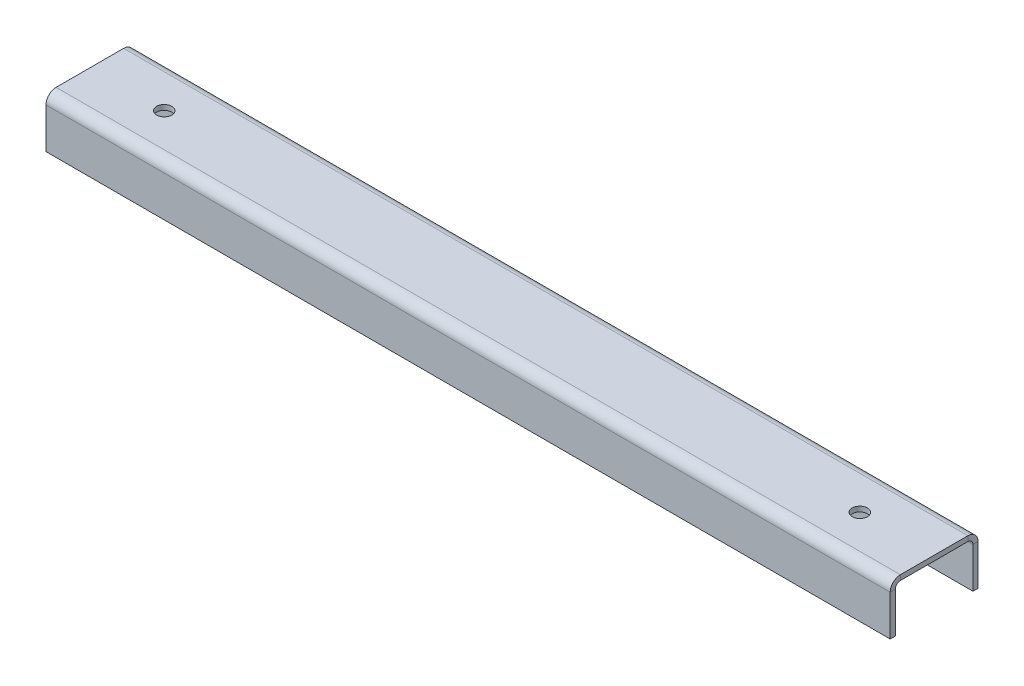
ISO-10303-21;
HEADER;
FILE_DESCRIPTION(('STEP AP214'),'2;1');
FILE_NAME('part.step','',(''),(''),'','','');
FILE_SCHEMA(('AUTOMOTIVE_DESIGN { 1 0 10303 214 1 1 1 1 }'));
ENDSEC;
DATA;
#1=APPLICATION_CONTEXT('core data for automotive mechanical design processes');
#2=APPLICATION_PROTOCOL_DEFINITION('international standard','automotive_design',2000,#1);
#3=PRODUCT_CONTEXT('',#1,'mechanical');
#4=PRODUCT('Part','Part','',(#3));
#5=PRODUCT_RELATED_PRODUCT_CATEGORY('part','',(#4));
#6=PRODUCT_DEFINITION_FORMATION('','',#4);
#7=PRODUCT_DEFINITION_CONTEXT('part definition',#1,'design');
#8=PRODUCT_DEFINITION('design','',#6,#7);
#9=PRODUCT_DEFINITION_SHAPE('','',#8);
#10=(LENGTH_UNIT() NAMED_UNIT(*) SI_UNIT(.MILLI.,.METRE.));
#11=(NAMED_UNIT(*) PLANE_ANGLE_UNIT() SI_UNIT($,.RADIAN.));
#12=(NAMED_UNIT(*) SI_UNIT($,.STERADIAN.) SOLID_ANGLE_UNIT());
#13=UNCERTAINTY_MEASURE_WITH_UNIT(LENGTH_MEASURE(1.E-05),#10,'distance_accuracy_value','');
#14=(GEOMETRIC_REPRESENTATION_CONTEXT(3) GLOBAL_UNCERTAINTY_ASSIGNED_CONTEXT((#13)) GLOBAL_UNIT_ASSIGNED_CONTEXT((#10,
#11,#12)) REPRESENTATION_CONTEXT('',''));
#15=CARTESIAN_POINT('',(0.,0.,0.));
#16=DIRECTION('',(0.,0.,1.));
#17=DIRECTION('',(1.,0.,0.));
#18=AXIS2_PLACEMENT_3D('',#15,#16,#17);
#19=CARTESIAN_POINT('',(1105.69166135613,-102525.563627841,-28920.0748257713));
#20=DIRECTION('',(-1.,0.,0.));
#21=DIRECTION('',(0.,0.,1.));
#22=AXIS2_PLACEMENT_3D('',#19,#20,#21);
#23=PLANE('',#22);
#24=DIRECTION('',(0.,0.,1.));
#25=VECTOR('',#24,1.);
#26=CARTESIAN_POINT('',(1105.69166135613,-102522.563627841,-28920.0748257713));
#27=LINE('',#26,#25);
#28=CARTESIAN_POINT('',(1105.69166135613,-102522.563627841,-28920.0748257713));
#29=VERTEX_POINT('',#28);
#30=CARTESIAN_POINT('',(1105.69166135613,-102522.563627841,-28880.0748257713));
#31=VERTEX_POINT('',#30);
#32=EDGE_CURVE('E268',#29,#31,#27,.T.);
#33=ORIENTED_EDGE('',*,*,#32,.F.);
#34=DIRECTION('',(0.,1.,0.));
#35=VECTOR('',#34,1.);
#36=CARTESIAN_POINT('',(1105.69166135613,-102525.563627841,-28920.0748257713));
#37=LINE('',#36,#35);
#38=CARTESIAN_POINT('',(1105.69166135613,-102525.563627841,-28920.0748257713));
#39=VERTEX_POINT('',#38);
#40=EDGE_CURVE('E13',#39,#29,#37,.T.);
#41=ORIENTED_EDGE('',*,*,#40,.F.);
#42=DIRECTION('',(0.,0.,1.));
#43=VECTOR('',#42,1.);
#44=CARTESIAN_POINT('',(1105.69166135613,-102525.563627841,-28920.0748257713));
#45=LINE('',#44,#43);
#46=CARTESIAN_POINT('',(1105.69166135613,-102525.563627841,-28880.0748257713));
#47=VERTEX_POINT('',#46);
#48=EDGE_CURVE('E271',#39,#47,#45,.T.);
#49=ORIENTED_EDGE('',*,*,#48,.T.);
#50=DIRECTION('',(0.,1.,0.));
#51=VECTOR('',#50,1.);
#52=CARTESIAN_POINT('',(1105.69166135613,-102525.563627841,-28880.0748257713));
#53=LINE('',#52,#51);
#54=EDGE_CURVE('E80',#47,#31,#53,.T.);
#55=ORIENTED_EDGE('',*,*,#54,.T.);
#56=EDGE_LOOP('',(#33,#41,#49,#55));
#57=FACE_BOUND('',#56,.T.);
#58=ADVANCED_FACE('F77',(#57),#23,.T.);
#59=CARTESIAN_POINT('',(1605.69166135613,-102525.563627841,-28920.0748257713));
#60=DIRECTION('',(1.,0.,0.));
#61=DIRECTION('',(0.,0.,-1.));
#62=AXIS2_PLACEMENT_3D('',#59,#60,#61);
#63=PLANE('',#62);
#64=DIRECTION('',(0.,0.,-1.));
#65=VECTOR('',#64,1.);
#66=CARTESIAN_POINT('',(1605.69166135613,-102522.563627841,-28920.0748257713));
#67=LINE('',#66,#65);
#68=CARTESIAN_POINT('',(1605.69166135613,-102522.563627841,-28880.0748257713));
#69=VERTEX_POINT('',#68);
#70=CARTESIAN_POINT('',(1605.69166135613,-102522.563627841,-28920.0748257713));
#71=VERTEX_POINT('',#70);
#72=EDGE_CURVE('E287',#69,#71,#67,.T.);
#73=ORIENTED_EDGE('',*,*,#72,.F.);
#74=DIRECTION('',(0.,1.,0.));
#75=VECTOR('',#74,1.);
#76=CARTESIAN_POINT('',(1605.69166135613,-102525.563627841,-28880.0748257713));
#77=LINE('',#76,#75);
#78=CARTESIAN_POINT('',(1605.69166135613,-102525.563627841,-28880.0748257713));
#79=VERTEX_POINT('',#78);
#80=EDGE_CURVE('E293',#79,#69,#77,.T.);
#81=ORIENTED_EDGE('',*,*,#80,.F.);
#82=DIRECTION('',(0.,0.,-1.));
#83=VECTOR('',#82,1.);
#84=CARTESIAN_POINT('',(1605.69166135613,-102525.563627841,-28920.0748257713));
#85=LINE('',#84,#83);
#86=CARTESIAN_POINT('',(1605.69166135613,-102525.563627841,-28920.0748257713));
#87=VERTEX_POINT('',#86);
#88=EDGE_CURVE('E277',#79,#87,#85,.T.);
#89=ORIENTED_EDGE('',*,*,#88,.T.);
#90=DIRECTION('',(0.,1.,0.));
#91=VECTOR('',#90,1.);
#92=CARTESIAN_POINT('',(1605.69166135613,-102525.563627841,-28920.0748257713));
#93=LINE('',#92,#91);
#94=EDGE_CURVE('E85',#87,#71,#93,.T.);
#95=ORIENTED_EDGE('',*,*,#94,.T.);
#96=EDGE_LOOP('',(#73,#81,#89,#95));
#97=FACE_BOUND('',#96,.T.);
#98=ADVANCED_FACE('F313',(#97),#63,.T.);
#99=CARTESIAN_POINT('',(0.,-102525.563627841,0.));
#100=DIRECTION('',(0.,1.,0.));
#101=DIRECTION('',(0.,0.,1.));
#102=AXIS2_PLACEMENT_3D('',#99,#100,#101);
#103=PLANE('',#102);
#104=CARTESIAN_POINT('',(1561.69166135613,-102525.563627841,-28900.0748257713));
#105=DIRECTION('',(0.,1.,0.));
#106=DIRECTION('',(0.,0.,1.));
#107=AXIS2_PLACEMENT_3D('',#104,#105,#106);
#108=CIRCLE('',#107,4.50000000000044);
#109=CARTESIAN_POINT('',(1561.69166135613,-102525.563627841,-28895.5748257713));
#110=VERTEX_POINT('',#109);
#111=EDGE_CURVE('E259',#110,#110,#108,.T.);
#112=ORIENTED_EDGE('',*,*,#111,.T.);
#113=EDGE_LOOP('',(#112));
#114=FACE_BOUND('',#113,.T.);
#115=CARTESIAN_POINT('',(1149.69166135613,-102525.563627841,-28900.0748257713));
#116=DIRECTION('',(0.,1.,0.));
#117=DIRECTION('',(0.,0.,1.));
#118=AXIS2_PLACEMENT_3D('',#115,#116,#117);
#119=CIRCLE('',#118,4.50000000000044);
#120=CARTESIAN_POINT('',(1149.69166135613,-102525.563627841,-28895.5748257713));
#121=VERTEX_POINT('',#120);
#122=EDGE_CURVE('E265',#121,#121,#119,.T.);
#123=ORIENTED_EDGE('',*,*,#122,.T.);
#124=EDGE_LOOP('',(#123));
#125=FACE_BOUND('',#124,.T.);
#126=ORIENTED_EDGE('',*,*,#48,.F.);
#127=DIRECTION('',(-1.,0.,0.));
#128=VECTOR('',#127,1.);
#129=CARTESIAN_POINT('',(1105.69166135613,-102525.563627841,-28920.0748257713));
#130=LINE('',#129,#128);
#131=EDGE_CURVE('E280',#87,#39,#130,.T.);
#132=ORIENTED_EDGE('',*,*,#131,.F.);
#133=ORIENTED_EDGE('',*,*,#88,.F.);
#134=DIRECTION('',(1.,0.,0.));
#135=VECTOR('',#134,1.);
#136=CARTESIAN_POINT('',(1105.69166135613,-102525.563627841,-28880.0748257713));
#137=LINE('',#136,#135);
#138=EDGE_CURVE('E274',#47,#79,#137,.T.);
#139=ORIENTED_EDGE('',*,*,#138,.F.);
#140=EDGE_LOOP('',(#126,#132,#133,#139));
#141=FACE_BOUND('',#140,.T.);
#142=ADVANCED_FACE('F318',(#114,#125,#141),#103,.F.);
#143=CARTESIAN_POINT('',(0.,-102522.563627841,0.));
#144=DIRECTION('',(0.,1.,0.));
#145=DIRECTION('',(0.,0.,1.));
#146=AXIS2_PLACEMENT_3D('',#143,#144,#145);
#147=PLANE('',#146);
#148=CARTESIAN_POINT('',(1561.69166135613,-102522.563627841,-28900.0748257713));
#149=DIRECTION('',(0.,1.,0.));
#150=DIRECTION('',(0.,0.,1.));
#151=AXIS2_PLACEMENT_3D('',#148,#149,#150);
#152=CIRCLE('',#151,4.50000000000044);
#153=CARTESIAN_POINT('',(1561.69166135613,-102522.563627841,-28895.5748257713));
#154=VERTEX_POINT('',#153);
#155=EDGE_CURVE('E250',#154,#154,#152,.T.);
#156=ORIENTED_EDGE('',*,*,#155,.F.);
#157=EDGE_LOOP('',(#156));
#158=FACE_BOUND('',#157,.T.);
#159=CARTESIAN_POINT('',(1149.69166135613,-102522.563627841,-28900.0748257713));
#160=DIRECTION('',(0.,1.,0.));
#161=DIRECTION('',(0.,0.,1.));
#162=AXIS2_PLACEMENT_3D('',#159,#160,#161);
#163=CIRCLE('',#162,4.50000000000044);
#164=CARTESIAN_POINT('',(1149.69166135613,-102522.563627841,-28895.5748257713));
#165=VERTEX_POINT('',#164);
#166=EDGE_CURVE('E262',#165,#165,#163,.T.);
#167=ORIENTED_EDGE('',*,*,#166,.F.);
#168=EDGE_LOOP('',(#167));
#169=FACE_BOUND('',#168,.T.);
#170=ORIENTED_EDGE('',*,*,#32,.T.);
#171=DIRECTION('',(1.,0.,0.));
#172=VECTOR('',#171,1.);
#173=CARTESIAN_POINT('',(1105.69166135613,-102522.563627841,-28880.0748257713));
#174=LINE('',#173,#172);
#175=EDGE_CURVE('E284',#31,#69,#174,.T.);
#176=ORIENTED_EDGE('',*,*,#175,.T.);
#177=ORIENTED_EDGE('',*,*,#72,.T.);
#178=DIRECTION('',(-1.,0.,0.));
#179=VECTOR('',#178,1.);
#180=CARTESIAN_POINT('',(1105.69166135613,-102522.563627841,-28920.0748257713));
#181=LINE('',#180,#179);
#182=EDGE_CURVE('E275',#71,#29,#181,.T.);
#183=ORIENTED_EDGE('',*,*,#182,.T.);
#184=EDGE_LOOP('',(#170,#176,#177,#183));
#185=FACE_BOUND('',#184,.T.);
#186=ADVANCED_FACE('F306',(#158,#169,#185),#147,.T.);
#187=CARTESIAN_POINT('',(1149.69166135613,-102525.563627841,-28900.0748257713));
#188=DIRECTION('',(0.,1.,0.));
#189=DIRECTION('',(0.,0.,1.));
#190=AXIS2_PLACEMENT_3D('',#187,#188,#189);
#191=CYLINDRICAL_SURFACE('',#190,4.50000000000044);
#192=ORIENTED_EDGE('',*,*,#122,.F.);
#193=EDGE_LOOP('',(#192));
#194=FACE_BOUND('',#193,.T.);
#195=ORIENTED_EDGE('',*,*,#166,.T.);
#196=EDGE_LOOP('',(#195));
#197=FACE_BOUND('',#196,.T.);
#198=ADVANCED_FACE('F348',(#194,#197),#191,.F.);
#199=CARTESIAN_POINT('',(1561.69166135613,-102525.563627841,-28900.0748257713));
#200=DIRECTION('',(0.,1.,0.));
#201=DIRECTION('',(0.,0.,1.));
#202=AXIS2_PLACEMENT_3D('',#199,#200,#201);
#203=CYLINDRICAL_SURFACE('',#202,4.50000000000044);
#204=ORIENTED_EDGE('',*,*,#111,.F.);
#205=EDGE_LOOP('',(#204));
#206=FACE_BOUND('',#205,.T.);
#207=ORIENTED_EDGE('',*,*,#155,.T.);
#208=EDGE_LOOP('',(#207));
#209=FACE_BOUND('',#208,.T.);
#210=ADVANCED_FACE('F353',(#206,#209),#203,.F.);
#211=CARTESIAN_POINT('',(1605.69166135613,-102528.563627841,-28880.0748257713));
#212=DIRECTION('',(1.,0.,0.));
#213=DIRECTION('',(0.,0.,-1.));
#214=AXIS2_PLACEMENT_3D('',#211,#212,#213);
#215=PLANE('',#214);
#216=DIRECTION('',(0.,0.,-1.));
#217=VECTOR('',#216,1.);
#218=CARTESIAN_POINT('',(1605.69166135613,-102528.563627841,-28874.0748257713));
#219=LINE('',#218,#217);
#220=CARTESIAN_POINT('',(1605.69166135613,-102528.563627841,-28877.0748257713));
#221=VERTEX_POINT('',#220);
#222=CARTESIAN_POINT('',(1605.69166135613,-102528.563627841,-28874.0748257713));
#223=VERTEX_POINT('',#222);
#224=EDGE_CURVE('E209',#221,#223,#219,.F.);
#225=ORIENTED_EDGE('',*,*,#224,.F.);
#226=CARTESIAN_POINT('',(1605.69166135613,-102528.563627841,-28880.0748257713));
#227=DIRECTION('',(-1.,0.,0.));
#228=DIRECTION('',(0.,0.,1.));
#229=AXIS2_PLACEMENT_3D('',#226,#227,#228);
#230=CIRCLE('',#229,2.99999999999656);
#231=EDGE_CURVE('E254',#79,#221,#230,.F.);
#232=ORIENTED_EDGE('',*,*,#231,.F.);
#233=ORIENTED_EDGE('',*,*,#80,.T.);
#234=CARTESIAN_POINT('',(1605.69166135613,-102528.563627841,-28880.0748257713));
#235=DIRECTION('',(-1.,0.,0.));
#236=DIRECTION('',(0.,0.,1.));
#237=AXIS2_PLACEMENT_3D('',#234,#235,#236);
#238=CIRCLE('',#237,5.99999999999656);
#239=EDGE_CURVE('E100',#69,#223,#238,.F.);
#240=ORIENTED_EDGE('',*,*,#239,.T.);
#241=EDGE_LOOP('',(#225,#232,#233,#240));
#242=FACE_BOUND('',#241,.T.);
#243=ADVANCED_FACE('F357',(#242),#215,.T.);
#244=CARTESIAN_POINT('',(1105.69166135613,-102528.563627841,-28880.0748257713));
#245=DIRECTION('',(1.,0.,0.));
#246=DIRECTION('',(0.,0.,-1.));
#247=AXIS2_PLACEMENT_3D('',#244,#245,#246);
#248=PLANE('',#247);
#249=CARTESIAN_POINT('',(1105.69166135613,-102528.563627841,-28880.0748257713));
#250=DIRECTION('',(-1.,0.,0.));
#251=DIRECTION('',(0.,0.,1.));
#252=AXIS2_PLACEMENT_3D('',#249,#250,#251);
#253=CIRCLE('',#252,2.99999999999656);
#254=CARTESIAN_POINT('',(1105.69166135613,-102528.563627841,-28877.0748257713));
#255=VERTEX_POINT('',#254);
#256=EDGE_CURVE('E222',#255,#47,#253,.T.);
#257=ORIENTED_EDGE('',*,*,#256,.F.);
#258=DIRECTION('',(0.,0.,-1.));
#259=VECTOR('',#258,1.);
#260=CARTESIAN_POINT('',(1105.69166135613,-102528.563627841,-28877.0748257713));
#261=LINE('',#260,#259);
#262=CARTESIAN_POINT('',(1105.69166135613,-102528.563627841,-28874.0748257713));
#263=VERTEX_POINT('',#262);
#264=EDGE_CURVE('E242',#255,#263,#261,.F.);
#265=ORIENTED_EDGE('',*,*,#264,.T.);
#266=CARTESIAN_POINT('',(1105.69166135613,-102528.563627841,-28880.0748257713));
#267=DIRECTION('',(-1.,0.,0.));
#268=DIRECTION('',(0.,0.,1.));
#269=AXIS2_PLACEMENT_3D('',#266,#267,#268);
#270=CIRCLE('',#269,5.99999999999656);
#271=EDGE_CURVE('E251',#263,#31,#270,.T.);
#272=ORIENTED_EDGE('',*,*,#271,.T.);
#273=ORIENTED_EDGE('',*,*,#54,.F.);
#274=EDGE_LOOP('',(#257,#265,#272,#273));
#275=FACE_BOUND('',#274,.T.);
#276=ADVANCED_FACE('F359',(#275),#248,.F.);
#277=CARTESIAN_POINT('',(1105.69166135613,-102528.563627841,-28880.0748257713));
#278=DIRECTION('',(-1.,0.,0.));
#279=DIRECTION('',(0.,0.,1.));
#280=AXIS2_PLACEMENT_3D('',#277,#278,#279);
#281=CYLINDRICAL_SURFACE('',#280,5.99999999999656);
#282=ORIENTED_EDGE('',*,*,#175,.F.);
#283=ORIENTED_EDGE('',*,*,#271,.F.);
#284=DIRECTION('',(-1.,0.,0.));
#285=VECTOR('',#284,1.);
#286=CARTESIAN_POINT('',(1605.69166135613,-102528.563627841,-28874.0748257713));
#287=LINE('',#286,#285);
#288=EDGE_CURVE('E240',#263,#223,#287,.F.);
#289=ORIENTED_EDGE('',*,*,#288,.T.);
#290=ORIENTED_EDGE('',*,*,#239,.F.);
#291=EDGE_LOOP('',(#282,#283,#289,#290));
#292=FACE_BOUND('',#291,.T.);
#293=ADVANCED_FACE('F362',(#292),#281,.T.);
#294=CARTESIAN_POINT('',(1105.69166135613,-102528.563627841,-28880.0748257713));
#295=DIRECTION('',(-1.,0.,0.));
#296=DIRECTION('',(0.,0.,1.));
#297=AXIS2_PLACEMENT_3D('',#294,#295,#296);
#298=CYLINDRICAL_SURFACE('',#297,2.99999999999656);
#299=ORIENTED_EDGE('',*,*,#138,.T.);
#300=ORIENTED_EDGE('',*,*,#231,.T.);
#301=DIRECTION('',(-1.,0.,0.));
#302=VECTOR('',#301,1.);
#303=CARTESIAN_POINT('',(1605.69166135613,-102528.563627841,-28877.0748257713));
#304=LINE('',#303,#302);
#305=EDGE_CURVE('E245',#221,#255,#304,.T.);
#306=ORIENTED_EDGE('',*,*,#305,.T.);
#307=ORIENTED_EDGE('',*,*,#256,.T.);
#308=EDGE_LOOP('',(#299,#300,#306,#307));
#309=FACE_BOUND('',#308,.T.);
#310=ADVANCED_FACE('F365',(#309),#298,.F.);
#311=CARTESIAN_POINT('',(1105.69166135613,-102552.563627841,-28874.0748257713));
#312=DIRECTION('',(1.,0.,0.));
#313=DIRECTION('',(0.,0.,-1.));
#314=AXIS2_PLACEMENT_3D('',#311,#312,#313);
#315=PLANE('',#314);
#316=ORIENTED_EDGE('',*,*,#264,.F.);
#317=DIRECTION('',(0.,1.,0.));
#318=VECTOR('',#317,1.);
#319=CARTESIAN_POINT('',(1105.69166135613,-102552.563627841,-28877.0748257713));
#320=LINE('',#319,#318);
#321=CARTESIAN_POINT('',(1105.69166135613,-102552.563627841,-28877.0748257713));
#322=VERTEX_POINT('',#321);
#323=EDGE_CURVE('E238',#255,#322,#320,.F.);
#324=ORIENTED_EDGE('',*,*,#323,.T.);
#325=DIRECTION('',(0.,0.,-1.));
#326=VECTOR('',#325,1.);
#327=CARTESIAN_POINT('',(1105.69166135613,-102552.563627841,-28874.0748257713));
#328=LINE('',#327,#326);
#329=CARTESIAN_POINT('',(1105.69166135613,-102552.563627841,-28874.0748257713));
#330=VERTEX_POINT('',#329);
#331=EDGE_CURVE('E219',#330,#322,#328,.T.);
#332=ORIENTED_EDGE('',*,*,#331,.F.);
#333=DIRECTION('',(0.,-1.,0.));
#334=VECTOR('',#333,1.);
#335=CARTESIAN_POINT('',(1105.69166135613,0.,-28874.0748257713));
#336=LINE('',#335,#334);
#337=EDGE_CURVE('E231',#263,#330,#336,.T.);
#338=ORIENTED_EDGE('',*,*,#337,.F.);
#339=EDGE_LOOP('',(#316,#324,#332,#338));
#340=FACE_BOUND('',#339,.T.);
#341=ADVANCED_FACE('F368',(#340),#315,.F.);
#342=CARTESIAN_POINT('',(1605.69166135613,-102525.563627841,-28874.0748257713));
#343=DIRECTION('',(-1.,0.,0.));
#344=DIRECTION('',(0.,0.,1.));
#345=AXIS2_PLACEMENT_3D('',#342,#343,#344);
#346=PLANE('',#345);
#347=ORIENTED_EDGE('',*,*,#224,.T.);
#348=DIRECTION('',(0.,1.,0.));
#349=VECTOR('',#348,1.);
#350=CARTESIAN_POINT('',(1605.69166135613,0.,-28874.0748257713));
#351=LINE('',#350,#349);
#352=CARTESIAN_POINT('',(1605.69166135613,-102552.563627841,-28874.0748257713));
#353=VERTEX_POINT('',#352);
#354=EDGE_CURVE('E226',#353,#223,#351,.T.);
#355=ORIENTED_EDGE('',*,*,#354,.F.);
#356=DIRECTION('',(0.,0.,-1.));
#357=VECTOR('',#356,1.);
#358=CARTESIAN_POINT('',(1605.69166135613,-102552.563627841,-28874.0748257713));
#359=LINE('',#358,#357);
#360=CARTESIAN_POINT('',(1605.69166135613,-102552.563627841,-28877.0748257713));
#361=VERTEX_POINT('',#360);
#362=EDGE_CURVE('E223',#353,#361,#359,.T.);
#363=ORIENTED_EDGE('',*,*,#362,.T.);
#364=DIRECTION('',(0.,-1.,0.));
#365=VECTOR('',#364,1.);
#366=CARTESIAN_POINT('',(1605.69166135613,-102525.563627841,-28877.0748257713));
#367=LINE('',#366,#365);
#368=EDGE_CURVE('E233',#361,#221,#367,.F.);
#369=ORIENTED_EDGE('',*,*,#368,.T.);
#370=EDGE_LOOP('',(#347,#355,#363,#369));
#371=FACE_BOUND('',#370,.T.);
#372=ADVANCED_FACE('F373',(#371),#346,.F.);
#373=CARTESIAN_POINT('',(0.,0.,-28874.0748257713));
#374=DIRECTION('',(0.,0.,-1.));
#375=DIRECTION('',(-1.,0.,0.));
#376=AXIS2_PLACEMENT_3D('',#373,#374,#375);
#377=PLANE('',#376);
#378=ORIENTED_EDGE('',*,*,#288,.F.);
#379=ORIENTED_EDGE('',*,*,#337,.T.);
#380=DIRECTION('',(1.,0.,0.));
#381=VECTOR('',#380,1.);
#382=CARTESIAN_POINT('',(0.,-102552.563627841,-28874.0748257713));
#383=LINE('',#382,#381);
#384=EDGE_CURVE('E229',#330,#353,#383,.T.);
#385=ORIENTED_EDGE('',*,*,#384,.T.);
#386=ORIENTED_EDGE('',*,*,#354,.T.);
#387=EDGE_LOOP('',(#378,#379,#385,#386));
#388=FACE_BOUND('',#387,.T.);
#389=ADVANCED_FACE('F378',(#388),#377,.F.);
#390=CARTESIAN_POINT('',(0.,0.,-28877.0748257713));
#391=DIRECTION('',(0.,0.,-1.));
#392=DIRECTION('',(-1.,0.,0.));
#393=AXIS2_PLACEMENT_3D('',#390,#391,#392);
#394=PLANE('',#393);
#395=ORIENTED_EDGE('',*,*,#323,.F.);
#396=ORIENTED_EDGE('',*,*,#305,.F.);
#397=ORIENTED_EDGE('',*,*,#368,.F.);
#398=DIRECTION('',(-1.,0.,0.));
#399=VECTOR('',#398,1.);
#400=CARTESIAN_POINT('',(1605.69166135613,-102552.563627841,-28877.0748257713));
#401=LINE('',#400,#399);
#402=EDGE_CURVE('E236',#322,#361,#401,.F.);
#403=ORIENTED_EDGE('',*,*,#402,.F.);
#404=EDGE_LOOP('',(#395,#396,#397,#403));
#405=FACE_BOUND('',#404,.T.);
#406=ADVANCED_FACE('F333',(#405),#394,.T.);
#407=CARTESIAN_POINT('',(1605.69166135613,-102552.563627841,-28874.0748257713));
#408=DIRECTION('',(0.,1.,0.));
#409=DIRECTION('',(0.,0.,1.));
#410=AXIS2_PLACEMENT_3D('',#407,#408,#409);
#411=PLANE('',#410);
#412=ORIENTED_EDGE('',*,*,#402,.T.);
#413=ORIENTED_EDGE('',*,*,#362,.F.);
#414=ORIENTED_EDGE('',*,*,#384,.F.);
#415=ORIENTED_EDGE('',*,*,#331,.T.);
#416=EDGE_LOOP('',(#412,#413,#414,#415));
#417=FACE_BOUND('',#416,.T.);
#418=ADVANCED_FACE('F326',(#417),#411,.F.);
#419=CARTESIAN_POINT('',(1105.69166135613,-102528.563627841,-28920.0748257713));
#420=DIRECTION('',(-1.,0.,0.));
#421=DIRECTION('',(0.,0.,1.));
#422=AXIS2_PLACEMENT_3D('',#419,#420,#421);
#423=PLANE('',#422);
#424=DIRECTION('',(0.,0.,1.));
#425=VECTOR('',#424,1.);
#426=CARTESIAN_POINT('',(1105.69166135613,-102528.563627841,-28926.0748257713));
#427=LINE('',#426,#425);
#428=CARTESIAN_POINT('',(1105.69166135613,-102528.563627841,-28923.0748257713));
#429=VERTEX_POINT('',#428);
#430=CARTESIAN_POINT('',(1105.69166135613,-102528.563627841,-28926.0748257713));
#431=VERTEX_POINT('',#430);
#432=EDGE_CURVE('E190',#429,#431,#427,.F.);
#433=ORIENTED_EDGE('',*,*,#432,.F.);
#434=CARTESIAN_POINT('',(1105.69166135613,-102528.563627841,-28920.0748257713));
#435=DIRECTION('',(1.,0.,0.));
#436=DIRECTION('',(0.,0.,-1.));
#437=AXIS2_PLACEMENT_3D('',#434,#435,#436);
#438=CIRCLE('',#437,2.99999999999656);
#439=EDGE_CURVE('E213',#39,#429,#438,.F.);
#440=ORIENTED_EDGE('',*,*,#439,.F.);
#441=ORIENTED_EDGE('',*,*,#40,.T.);
#442=CARTESIAN_POINT('',(1105.69166135613,-102528.563627841,-28920.0748257713));
#443=DIRECTION('',(1.,0.,0.));
#444=DIRECTION('',(0.,0.,-1.));
#445=AXIS2_PLACEMENT_3D('',#442,#443,#444);
#446=CIRCLE('',#445,5.99999999999656);
#447=EDGE_CURVE('E93',#29,#431,#446,.F.);
#448=ORIENTED_EDGE('',*,*,#447,.T.);
#449=EDGE_LOOP('',(#433,#440,#441,#448));
#450=FACE_BOUND('',#449,.T.);
#451=ADVANCED_FACE('F324',(#450),#423,.T.);
#452=CARTESIAN_POINT('',(1605.69166135613,-102528.563627841,-28920.0748257713));
#453=DIRECTION('',(-1.,0.,0.));
#454=DIRECTION('',(0.,0.,1.));
#455=AXIS2_PLACEMENT_3D('',#452,#453,#454);
#456=PLANE('',#455);
#457=CARTESIAN_POINT('',(1605.69166135613,-102528.563627841,-28920.0748257713));
#458=DIRECTION('',(1.,0.,0.));
#459=DIRECTION('',(0.,0.,-1.));
#460=AXIS2_PLACEMENT_3D('',#457,#458,#459);
#461=CIRCLE('',#460,2.99999999999656);
#462=CARTESIAN_POINT('',(1605.69166135613,-102528.563627841,-28923.0748257713));
#463=VERTEX_POINT('',#462);
#464=EDGE_CURVE('E216',#463,#87,#461,.T.);
#465=ORIENTED_EDGE('',*,*,#464,.F.);
#466=DIRECTION('',(0.,0.,1.));
#467=VECTOR('',#466,1.);
#468=CARTESIAN_POINT('',(1605.69166135613,-102528.563627841,-28923.0748257713));
#469=LINE('',#468,#467);
#470=CARTESIAN_POINT('',(1605.69166135613,-102528.563627841,-28926.0748257713));
#471=VERTEX_POINT('',#470);
#472=EDGE_CURVE('E202',#463,#471,#469,.F.);
#473=ORIENTED_EDGE('',*,*,#472,.T.);
#474=CARTESIAN_POINT('',(1605.69166135613,-102528.563627841,-28920.0748257713));
#475=DIRECTION('',(1.,0.,0.));
#476=DIRECTION('',(0.,0.,-1.));
#477=AXIS2_PLACEMENT_3D('',#474,#475,#476);
#478=CIRCLE('',#477,5.99999999999656);
#479=EDGE_CURVE('E210',#471,#71,#478,.T.);
#480=ORIENTED_EDGE('',*,*,#479,.T.);
#481=ORIENTED_EDGE('',*,*,#94,.F.);
#482=EDGE_LOOP('',(#465,#473,#480,#481));
#483=FACE_BOUND('',#482,.T.);
#484=ADVANCED_FACE('F310',(#483),#456,.F.);
#485=CARTESIAN_POINT('',(1605.69166135613,-102528.563627841,-28920.0748257713));
#486=DIRECTION('',(1.,0.,0.));
#487=DIRECTION('',(0.,0.,-1.));
#488=AXIS2_PLACEMENT_3D('',#485,#486,#487);
#489=CYLINDRICAL_SURFACE('',#488,5.99999999999656);
#490=ORIENTED_EDGE('',*,*,#182,.F.);
#491=ORIENTED_EDGE('',*,*,#479,.F.);
#492=DIRECTION('',(1.,0.,0.));
#493=VECTOR('',#492,1.);
#494=CARTESIAN_POINT('',(1105.69166135613,-102528.563627841,-28926.0748257713));
#495=LINE('',#494,#493);
#496=EDGE_CURVE('E200',#471,#431,#495,.F.);
#497=ORIENTED_EDGE('',*,*,#496,.T.);
#498=ORIENTED_EDGE('',*,*,#447,.F.);
#499=EDGE_LOOP('',(#490,#491,#497,#498));
#500=FACE_BOUND('',#499,.T.);
#501=ADVANCED_FACE('F307',(#500),#489,.T.);
#502=CARTESIAN_POINT('',(1605.69166135613,-102528.563627841,-28920.0748257713));
#503=DIRECTION('',(1.,0.,0.));
#504=DIRECTION('',(0.,0.,-1.));
#505=AXIS2_PLACEMENT_3D('',#502,#503,#504);
#506=CYLINDRICAL_SURFACE('',#505,2.99999999999656);
#507=ORIENTED_EDGE('',*,*,#131,.T.);
#508=ORIENTED_EDGE('',*,*,#439,.T.);
#509=DIRECTION('',(1.,0.,0.));
#510=VECTOR('',#509,1.);
#511=CARTESIAN_POINT('',(1105.69166135613,-102528.563627841,-28923.0748257713));
#512=LINE('',#511,#510);
#513=EDGE_CURVE('E205',#429,#463,#512,.T.);
#514=ORIENTED_EDGE('',*,*,#513,.T.);
#515=ORIENTED_EDGE('',*,*,#464,.T.);
#516=EDGE_LOOP('',(#507,#508,#514,#515));
#517=FACE_BOUND('',#516,.T.);
#518=ADVANCED_FACE('F321',(#517),#506,.F.);
#519=CARTESIAN_POINT('',(1605.69166135613,-102552.563627841,-28926.0748257713));
#520=DIRECTION('',(-1.,0.,0.));
#521=DIRECTION('',(0.,0.,1.));
#522=AXIS2_PLACEMENT_3D('',#519,#520,#521);
#523=PLANE('',#522);
#524=ORIENTED_EDGE('',*,*,#472,.F.);
#525=DIRECTION('',(0.,1.,0.));
#526=VECTOR('',#525,1.);
#527=CARTESIAN_POINT('',(1605.69166135613,-102552.563627841,-28923.0748257713));
#528=LINE('',#527,#526);
#529=CARTESIAN_POINT('',(1605.69166135613,-102552.563627841,-28923.0748257713));
#530=VERTEX_POINT('',#529);
#531=EDGE_CURVE('E198',#463,#530,#528,.F.);
#532=ORIENTED_EDGE('',*,*,#531,.T.);
#533=DIRECTION('',(0.,0.,1.));
#534=VECTOR('',#533,1.);
#535=CARTESIAN_POINT('',(1605.69166135613,-102552.563627841,-28926.0748257713));
#536=LINE('',#535,#534);
#537=CARTESIAN_POINT('',(1605.69166135613,-102552.563627841,-28926.0748257713));
#538=VERTEX_POINT('',#537);
#539=EDGE_CURVE('E186',#538,#530,#536,.T.);
#540=ORIENTED_EDGE('',*,*,#539,.F.);
#541=DIRECTION('',(0.,-1.,0.));
#542=VECTOR('',#541,1.);
#543=CARTESIAN_POINT('',(1605.69166135613,0.,-28926.0748257713));
#544=LINE('',#543,#542);
#545=EDGE_CURVE('E173',#471,#538,#544,.T.);
#546=ORIENTED_EDGE('',*,*,#545,.F.);
#547=EDGE_LOOP('',(#524,#532,#540,#546));
#548=FACE_BOUND('',#547,.T.);
#549=ADVANCED_FACE('F439',(#548),#523,.F.);
#550=CARTESIAN_POINT('',(1105.69166135613,-102525.563627841,-28926.0748257713));
#551=DIRECTION('',(1.,0.,0.));
#552=DIRECTION('',(0.,0.,-1.));
#553=AXIS2_PLACEMENT_3D('',#550,#551,#552);
#554=PLANE('',#553);
#555=ORIENTED_EDGE('',*,*,#432,.T.);
#556=DIRECTION('',(0.,1.,0.));
#557=VECTOR('',#556,1.);
#558=CARTESIAN_POINT('',(1105.69166135613,0.,-28926.0748257713));
#559=LINE('',#558,#557);
#560=CARTESIAN_POINT('',(1105.69166135613,-102552.563627841,-28926.0748257713));
#561=VERTEX_POINT('',#560);
#562=EDGE_CURVE('E171',#561,#431,#559,.T.);
#563=ORIENTED_EDGE('',*,*,#562,.F.);
#564=DIRECTION('',(0.,0.,1.));
#565=VECTOR('',#564,1.);
#566=CARTESIAN_POINT('',(1105.69166135613,-102552.563627841,-28926.0748257713));
#567=LINE('',#566,#565);
#568=CARTESIAN_POINT('',(1105.69166135613,-102552.563627841,-28923.0748257713));
#569=VERTEX_POINT('',#568);
#570=EDGE_CURVE('E179',#561,#569,#567,.T.);
#571=ORIENTED_EDGE('',*,*,#570,.T.);
#572=DIRECTION('',(0.,-1.,0.));
#573=VECTOR('',#572,1.);
#574=CARTESIAN_POINT('',(1105.69166135613,-102525.563627841,-28923.0748257713));
#575=LINE('',#574,#573);
#576=EDGE_CURVE('E195',#569,#429,#575,.F.);
#577=ORIENTED_EDGE('',*,*,#576,.T.);
#578=EDGE_LOOP('',(#555,#563,#571,#577));
#579=FACE_BOUND('',#578,.T.);
#580=ADVANCED_FACE('F189',(#579),#554,.F.);
#581=CARTESIAN_POINT('',(0.,0.,-28926.0748257713));
#582=DIRECTION('',(0.,0.,1.));
#583=DIRECTION('',(1.,0.,0.));
#584=AXIS2_PLACEMENT_3D('',#581,#582,#583);
#585=PLANE('',#584);
#586=ORIENTED_EDGE('',*,*,#496,.F.);
#587=ORIENTED_EDGE('',*,*,#545,.T.);
#588=DIRECTION('',(-1.,0.,0.));
#589=VECTOR('',#588,1.);
#590=CARTESIAN_POINT('',(0.,-102552.563627841,-28926.0748257713));
#591=LINE('',#590,#589);
#592=EDGE_CURVE('E166',#538,#561,#591,.T.);
#593=ORIENTED_EDGE('',*,*,#592,.T.);
#594=ORIENTED_EDGE('',*,*,#562,.T.);
#595=EDGE_LOOP('',(#586,#587,#593,#594));
#596=FACE_BOUND('',#595,.T.);
#597=ADVANCED_FACE('F169',(#596),#585,.F.);
#598=CARTESIAN_POINT('',(0.,0.,-28923.0748257713));
#599=DIRECTION('',(0.,0.,1.));
#600=DIRECTION('',(1.,0.,0.));
#601=AXIS2_PLACEMENT_3D('',#598,#599,#600);
#602=PLANE('',#601);
#603=ORIENTED_EDGE('',*,*,#531,.F.);
#604=ORIENTED_EDGE('',*,*,#513,.F.);
#605=ORIENTED_EDGE('',*,*,#576,.F.);
#606=DIRECTION('',(1.,0.,0.));
#607=VECTOR('',#606,1.);
#608=CARTESIAN_POINT('',(1105.69166135613,-102552.563627841,-28923.0748257713));
#609=LINE('',#608,#607);
#610=EDGE_CURVE('E182',#530,#569,#609,.F.);
#611=ORIENTED_EDGE('',*,*,#610,.F.);
#612=EDGE_LOOP('',(#603,#604,#605,#611));
#613=FACE_BOUND('',#612,.T.);
#614=ADVANCED_FACE('F467',(#613),#602,.T.);
#615=CARTESIAN_POINT('',(1105.69166135613,-102552.563627841,-28926.0748257713));
#616=DIRECTION('',(0.,1.,0.));
#617=DIRECTION('',(0.,0.,1.));
#618=AXIS2_PLACEMENT_3D('',#615,#616,#617);
#619=PLANE('',#618);
#620=ORIENTED_EDGE('',*,*,#610,.T.);
#621=ORIENTED_EDGE('',*,*,#570,.F.);
#622=ORIENTED_EDGE('',*,*,#592,.F.);
#623=ORIENTED_EDGE('',*,*,#539,.T.);
#624=EDGE_LOOP('',(#620,#621,#622,#623));
#625=FACE_BOUND('',#624,.T.);
#626=ADVANCED_FACE('F180',(#625),#619,.F.);
#627=CLOSED_SHELL('',(#58,#98,#142,#186,#198,#210,#243,#276,#293,#310,#341,#372,#389,#406,#418,
#451,#484,#501,#518,#549,#580,#597,#614,#626));
#628=MANIFOLD_SOLID_BREP('B2',#627);
#629=ADVANCED_BREP_SHAPE_REPRESENTATION('',(#18,#628),#14);
#630=SHAPE_DEFINITION_REPRESENTATION(#9,#629);
ENDSEC;
END-ISO-10303-21;
